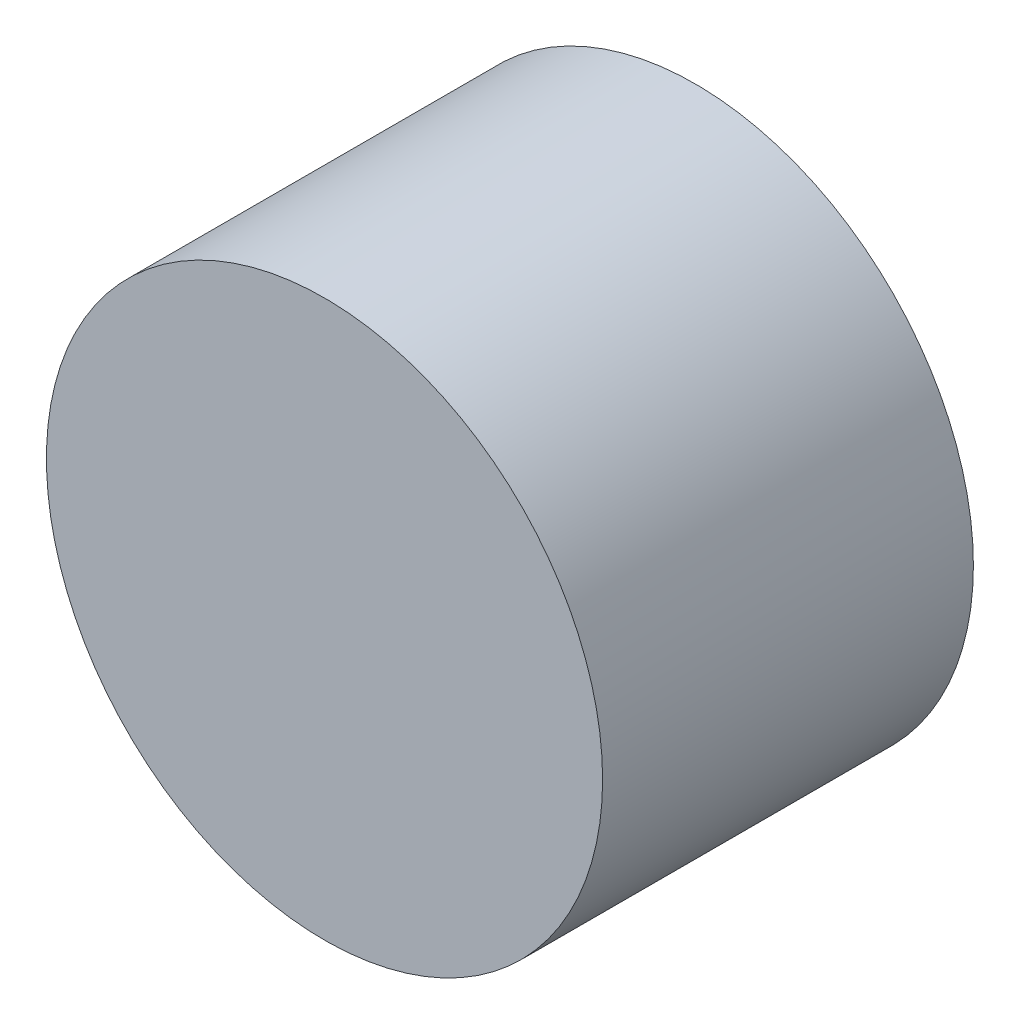
ISO-10303-21;
HEADER;
FILE_DESCRIPTION(('STEP AP214'),'2;1');
FILE_NAME('part.step','',(''),(''),'','','');
FILE_SCHEMA(('AUTOMOTIVE_DESIGN { 1 0 10303 214 1 1 1 1 }'));
ENDSEC;
DATA;
#1=APPLICATION_CONTEXT('core data for automotive mechanical design processes');
#2=APPLICATION_PROTOCOL_DEFINITION('international standard','automotive_design',2000,#1);
#3=PRODUCT_CONTEXT('',#1,'mechanical');
#4=PRODUCT('Part','Part','',(#3));
#5=PRODUCT_RELATED_PRODUCT_CATEGORY('part','',(#4));
#6=PRODUCT_DEFINITION_FORMATION('','',#4);
#7=PRODUCT_DEFINITION_CONTEXT('part definition',#1,'design');
#8=PRODUCT_DEFINITION('design','',#6,#7);
#9=PRODUCT_DEFINITION_SHAPE('','',#8);
#10=(LENGTH_UNIT() NAMED_UNIT(*) SI_UNIT(.MILLI.,.METRE.));
#11=(NAMED_UNIT(*) PLANE_ANGLE_UNIT() SI_UNIT($,.RADIAN.));
#12=(NAMED_UNIT(*) SI_UNIT($,.STERADIAN.) SOLID_ANGLE_UNIT());
#13=UNCERTAINTY_MEASURE_WITH_UNIT(LENGTH_MEASURE(1.E-05),#10,'distance_accuracy_value','');
#14=(GEOMETRIC_REPRESENTATION_CONTEXT(3) GLOBAL_UNCERTAINTY_ASSIGNED_CONTEXT((#13)) GLOBAL_UNIT_ASSIGNED_CONTEXT((#10,
#11,#12)) REPRESENTATION_CONTEXT('',''));
#15=CARTESIAN_POINT('',(0.,0.,0.));
#16=DIRECTION('',(0.,0.,1.));
#17=DIRECTION('',(1.,0.,0.));
#18=AXIS2_PLACEMENT_3D('',#15,#16,#17);
#19=CARTESIAN_POINT('',(0.,0.,8.));
#20=DIRECTION('',(0.,0.,-1.));
#21=DIRECTION('',(-1.,0.,0.));
#22=AXIS2_PLACEMENT_3D('',#19,#20,#21);
#23=CYLINDRICAL_SURFACE('',#22,6.);
#24=CARTESIAN_POINT('',(0.,0.,8.));
#25=DIRECTION('',(0.,0.,1.));
#26=DIRECTION('',(1.,0.,0.));
#27=AXIS2_PLACEMENT_3D('',#24,#25,#26);
#28=CIRCLE('',#27,6.);
#29=CARTESIAN_POINT('',(6.,0.,8.));
#30=VERTEX_POINT('',#29);
#31=EDGE_CURVE('E10',#30,#30,#28,.T.);
#32=ORIENTED_EDGE('',*,*,#31,.F.);
#33=EDGE_LOOP('',(#32));
#34=FACE_BOUND('',#33,.T.);
#35=CARTESIAN_POINT('',(0.,0.,0.));
#36=DIRECTION('',(0.,0.,1.));
#37=DIRECTION('',(1.,0.,0.));
#38=AXIS2_PLACEMENT_3D('',#35,#36,#37);
#39=CIRCLE('',#38,6.);
#40=CARTESIAN_POINT('',(6.,0.,0.));
#41=VERTEX_POINT('',#40);
#42=EDGE_CURVE('E48',#41,#41,#39,.T.);
#43=ORIENTED_EDGE('',*,*,#42,.T.);
#44=EDGE_LOOP('',(#43));
#45=FACE_BOUND('',#44,.T.);
#46=ADVANCED_FACE('F45',(#34,#45),#23,.T.);
#47=CARTESIAN_POINT('',(0.,0.,8.));
#48=DIRECTION('',(0.,0.,1.));
#49=DIRECTION('',(1.,0.,0.));
#50=AXIS2_PLACEMENT_3D('',#47,#48,#49);
#51=PLANE('',#50);
#52=ORIENTED_EDGE('',*,*,#31,.T.);
#53=EDGE_LOOP('',(#52));
#54=FACE_BOUND('',#53,.T.);
#55=ADVANCED_FACE('F79',(#54),#51,.T.);
#56=CARTESIAN_POINT('',(0.,0.,0.));
#57=DIRECTION('',(0.,0.,1.));
#58=DIRECTION('',(1.,0.,0.));
#59=AXIS2_PLACEMENT_3D('',#56,#57,#58);
#60=PLANE('',#59);
#61=CARTESIAN_POINT('',(0.,0.,0.));
#62=DIRECTION('',(0.,0.,1.));
#63=DIRECTION('',(1.,0.,0.));
#64=AXIS2_PLACEMENT_3D('',#61,#62,#63);
#65=CIRCLE('',#64,4.25);
#66=CARTESIAN_POINT('',(4.25,0.,0.));
#67=VERTEX_POINT('',#66);
#68=EDGE_CURVE('E59',#67,#67,#65,.T.);
#69=ORIENTED_EDGE('',*,*,#68,.T.);
#70=EDGE_LOOP('',(#69));
#71=FACE_BOUND('',#70,.T.);
#72=ORIENTED_EDGE('',*,*,#42,.F.);
#73=EDGE_LOOP('',(#72));
#74=FACE_BOUND('',#73,.T.);
#75=ADVANCED_FACE('F76',(#71,#74),#60,.F.);
#76=CARTESIAN_POINT('',(0.,0.,5.5));
#77=DIRECTION('',(0.,0.,-1.));
#78=DIRECTION('',(-1.,0.,0.));
#79=AXIS2_PLACEMENT_3D('',#76,#77,#78);
#80=CYLINDRICAL_SURFACE('',#79,4.25);
#81=CARTESIAN_POINT('',(0.,0.,5.5));
#82=DIRECTION('',(0.,0.,1.));
#83=DIRECTION('',(1.,0.,0.));
#84=AXIS2_PLACEMENT_3D('',#81,#82,#83);
#85=CIRCLE('',#84,4.25);
#86=CARTESIAN_POINT('',(4.25,0.,5.5));
#87=VERTEX_POINT('',#86);
#88=EDGE_CURVE('E57',#87,#87,#85,.T.);
#89=ORIENTED_EDGE('',*,*,#88,.T.);
#90=EDGE_LOOP('',(#89));
#91=FACE_BOUND('',#90,.T.);
#92=ORIENTED_EDGE('',*,*,#68,.F.);
#93=EDGE_LOOP('',(#92));
#94=FACE_BOUND('',#93,.T.);
#95=ADVANCED_FACE('F67',(#91,#94),#80,.F.);
#96=CARTESIAN_POINT('',(0.,0.,5.5));
#97=DIRECTION('',(0.,0.,1.));
#98=DIRECTION('',(1.,0.,0.));
#99=AXIS2_PLACEMENT_3D('',#96,#97,#98);
#100=PLANE('',#99);
#101=ORIENTED_EDGE('',*,*,#88,.F.);
#102=EDGE_LOOP('',(#101));
#103=FACE_BOUND('',#102,.T.);
#104=ADVANCED_FACE('F70',(#103),#100,.F.);
#105=CLOSED_SHELL('',(#46,#55,#75,#95,#104));
#106=MANIFOLD_SOLID_BREP('B2',#105);
#107=ADVANCED_BREP_SHAPE_REPRESENTATION('',(#18,#106),#14);
#108=SHAPE_DEFINITION_REPRESENTATION(#9,#107);
ENDSEC;
END-ISO-10303-21;
